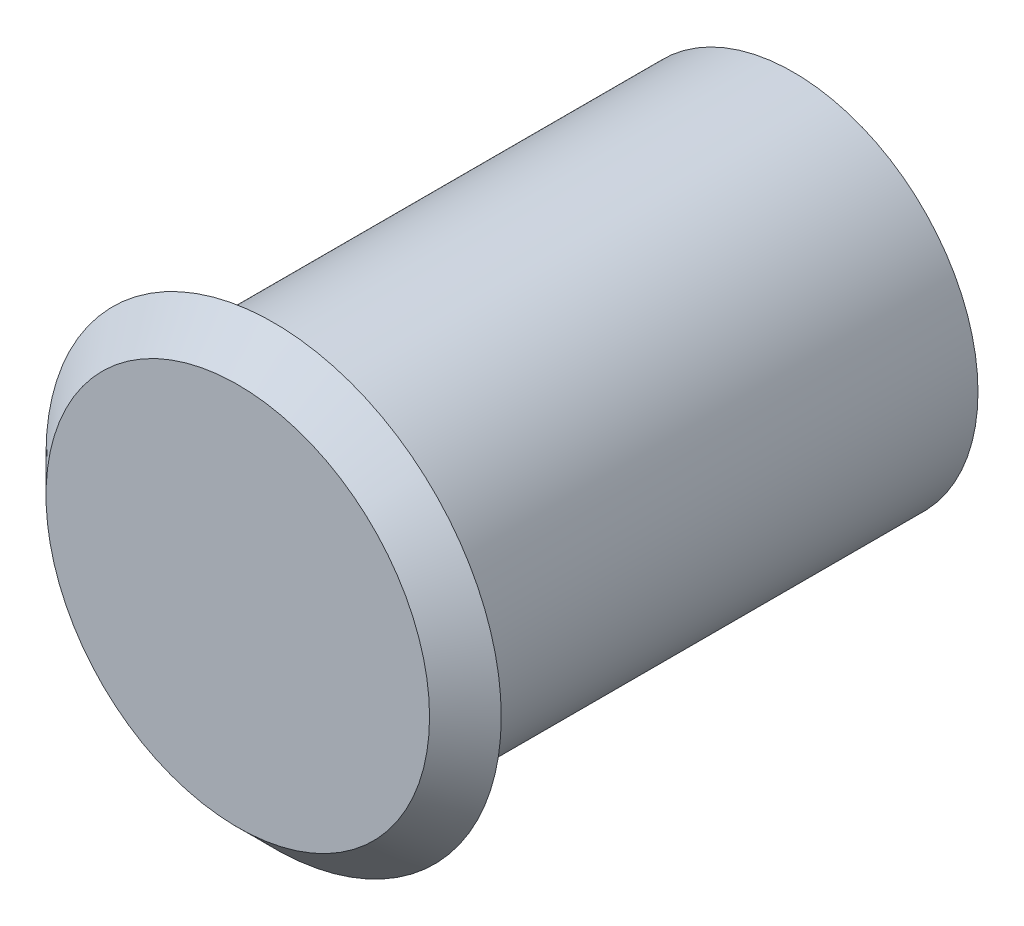
ISO-10303-21;
HEADER;
FILE_DESCRIPTION(('STEP AP214'),'2;1');
FILE_NAME('part.step','',(''),(''),'','','');
FILE_SCHEMA(('AUTOMOTIVE_DESIGN { 1 0 10303 214 1 1 1 1 }'));
ENDSEC;
DATA;
#1=APPLICATION_CONTEXT('core data for automotive mechanical design processes');
#2=APPLICATION_PROTOCOL_DEFINITION('international standard','automotive_design',2000,#1);
#3=PRODUCT_CONTEXT('',#1,'mechanical');
#4=PRODUCT('Part','Part','',(#3));
#5=PRODUCT_RELATED_PRODUCT_CATEGORY('part','',(#4));
#6=PRODUCT_DEFINITION_FORMATION('','',#4);
#7=PRODUCT_DEFINITION_CONTEXT('part definition',#1,'design');
#8=PRODUCT_DEFINITION('design','',#6,#7);
#9=PRODUCT_DEFINITION_SHAPE('','',#8);
#10=(LENGTH_UNIT() NAMED_UNIT(*) SI_UNIT(.MILLI.,.METRE.));
#11=(NAMED_UNIT(*) PLANE_ANGLE_UNIT() SI_UNIT($,.RADIAN.));
#12=(NAMED_UNIT(*) SI_UNIT($,.STERADIAN.) SOLID_ANGLE_UNIT());
#13=UNCERTAINTY_MEASURE_WITH_UNIT(LENGTH_MEASURE(1.E-05),#10,'distance_accuracy_value','');
#14=(GEOMETRIC_REPRESENTATION_CONTEXT(3) GLOBAL_UNCERTAINTY_ASSIGNED_CONTEXT((#13)) GLOBAL_UNIT_ASSIGNED_CONTEXT((#10,
#11,#12)) REPRESENTATION_CONTEXT('',''));
#15=CARTESIAN_POINT('',(0.,0.,0.));
#16=DIRECTION('',(0.,0.,1.));
#17=DIRECTION('',(1.,0.,0.));
#18=AXIS2_PLACEMENT_3D('',#15,#16,#17);
#19=CARTESIAN_POINT('',(0.,0.,29.));
#20=DIRECTION('',(0.,0.,-1.));
#21=DIRECTION('',(-1.,0.,0.));
#22=AXIS2_PLACEMENT_3D('',#19,#20,#21);
#23=CYLINDRICAL_SURFACE('',#22,10.3);
#24=CARTESIAN_POINT('',(0.,0.,29.));
#25=DIRECTION('',(0.,0.,1.));
#26=DIRECTION('',(1.,0.,0.));
#27=AXIS2_PLACEMENT_3D('',#24,#25,#26);
#28=CIRCLE('',#27,10.3);
#29=CARTESIAN_POINT('',(-10.3,0.,29.));
#30=VERTEX_POINT('',#29);
#31=EDGE_CURVE('E47',#30,#30,#28,.T.);
#32=CARTESIAN_POINT('',(0.,0.,0.));
#33=DIRECTION('',(0.,0.,1.));
#34=DIRECTION('',(1.,0.,0.));
#35=AXIS2_PLACEMENT_3D('',#32,#33,#34);
#36=CIRCLE('',#35,10.3);
#37=CARTESIAN_POINT('',(-10.3,0.,0.));
#38=VERTEX_POINT('',#37);
#39=EDGE_CURVE('E51',#38,#38,#36,.T.);
#40=CARTESIAN_POINT('',(-10.3,0.,29.));
#41=CARTESIAN_POINT('',(-10.3,0.,28.6979166666667));
#42=CARTESIAN_POINT('',(-10.3,0.,28.3958333333333));
#43=CARTESIAN_POINT('',(-10.3,0.,27.7916666666667));
#44=CARTESIAN_POINT('',(-10.3,0.,27.4895833333333));
#45=CARTESIAN_POINT('',(-10.3,0.,26.8854166666667));
#46=CARTESIAN_POINT('',(-10.3,0.,26.5833333333333));
#47=CARTESIAN_POINT('',(-10.3,0.,25.9791666666667));
#48=CARTESIAN_POINT('',(-10.3,0.,25.6770833333333));
#49=CARTESIAN_POINT('',(-10.3,0.,25.0729166666667));
#50=CARTESIAN_POINT('',(-10.3,0.,24.7708333333333));
#51=CARTESIAN_POINT('',(-10.3,0.,24.1666666666667));
#52=CARTESIAN_POINT('',(-10.3,0.,23.8645833333333));
#53=CARTESIAN_POINT('',(-10.3,0.,23.2604166666667));
#54=CARTESIAN_POINT('',(-10.3,0.,22.9583333333333));
#55=CARTESIAN_POINT('',(-10.3,0.,22.3541666666667));
#56=CARTESIAN_POINT('',(-10.3,0.,22.0520833333333));
#57=CARTESIAN_POINT('',(-10.3,0.,21.4479166666667));
#58=CARTESIAN_POINT('',(-10.3,0.,21.1458333333333));
#59=CARTESIAN_POINT('',(-10.3,0.,20.5416666666667));
#60=CARTESIAN_POINT('',(-10.3,0.,20.2395833333333));
#61=CARTESIAN_POINT('',(-10.3,0.,19.6354166666667));
#62=CARTESIAN_POINT('',(-10.3,0.,19.3333333333333));
#63=CARTESIAN_POINT('',(-10.3,0.,18.7291666666667));
#64=CARTESIAN_POINT('',(-10.3,0.,18.4270833333333));
#65=CARTESIAN_POINT('',(-10.3,0.,17.8229166666667));
#66=CARTESIAN_POINT('',(-10.3,0.,17.5208333333333));
#67=CARTESIAN_POINT('',(-10.3,0.,16.9166666666667));
#68=CARTESIAN_POINT('',(-10.3,0.,16.6145833333333));
#69=CARTESIAN_POINT('',(-10.3,0.,16.0104166666667));
#70=CARTESIAN_POINT('',(-10.3,0.,15.7083333333333));
#71=CARTESIAN_POINT('',(-10.3,0.,15.1041666666667));
#72=CARTESIAN_POINT('',(-10.3,0.,14.8020833333333));
#73=CARTESIAN_POINT('',(-10.3,0.,14.1979166666667));
#74=CARTESIAN_POINT('',(-10.3,0.,13.8958333333333));
#75=CARTESIAN_POINT('',(-10.3,0.,13.2916666666667));
#76=CARTESIAN_POINT('',(-10.3,0.,12.9895833333333));
#77=CARTESIAN_POINT('',(-10.3,0.,12.3854166666667));
#78=CARTESIAN_POINT('',(-10.3,0.,12.0833333333333));
#79=CARTESIAN_POINT('',(-10.3,0.,11.4791666666667));
#80=CARTESIAN_POINT('',(-10.3,0.,11.1770833333333));
#81=CARTESIAN_POINT('',(-10.3,0.,10.5729166666667));
#82=CARTESIAN_POINT('',(-10.3,0.,10.2708333333333));
#83=CARTESIAN_POINT('',(-10.3,0.,9.66666666666667));
#84=CARTESIAN_POINT('',(-10.3,0.,9.36458333333333));
#85=CARTESIAN_POINT('',(-10.3,0.,8.76041666666667));
#86=CARTESIAN_POINT('',(-10.3,0.,8.45833333333333));
#87=CARTESIAN_POINT('',(-10.3,0.,7.85416666666667));
#88=CARTESIAN_POINT('',(-10.3,0.,7.55208333333333));
#89=CARTESIAN_POINT('',(-10.3,0.,6.94791666666667));
#90=CARTESIAN_POINT('',(-10.3,0.,6.64583333333333));
#91=CARTESIAN_POINT('',(-10.3,0.,6.04166666666667));
#92=CARTESIAN_POINT('',(-10.3,0.,5.73958333333333));
#93=CARTESIAN_POINT('',(-10.3,0.,5.13541666666667));
#94=CARTESIAN_POINT('',(-10.3,0.,4.83333333333333));
#95=CARTESIAN_POINT('',(-10.3,0.,4.22916666666667));
#96=CARTESIAN_POINT('',(-10.3,0.,3.92708333333333));
#97=CARTESIAN_POINT('',(-10.3,0.,3.32291666666667));
#98=CARTESIAN_POINT('',(-10.3,0.,3.02083333333333));
#99=CARTESIAN_POINT('',(-10.3,0.,2.41666666666667));
#100=CARTESIAN_POINT('',(-10.3,0.,2.11458333333333));
#101=CARTESIAN_POINT('',(-10.3,0.,1.51041666666667));
#102=CARTESIAN_POINT('',(-10.3,0.,1.20833333333333));
#103=CARTESIAN_POINT('',(-10.3,0.,0.604166666666667));
#104=CARTESIAN_POINT('',(-10.3,0.,0.302083333333333));
#105=CARTESIAN_POINT('',(-10.3,0.,0.));
#106=B_SPLINE_CURVE_WITH_KNOTS('',3,(#40,#41,#42,#43,#44,#45,#46,#47,#48,#49,#50,#51,#52,#53,
#54,#55,#56,#57,#58,#59,#60,#61,#62,#63,#64,#65,#66,#67,#68,#69,#70,#71,#72,#73,#74,#75,#76,#77,
#78,#79,#80,#81,#82,#83,#84,#85,#86,#87,#88,#89,#90,#91,#92,#93,#94,#95,#96,#97,#98,#99,#100,
#101,#102,#103,#104,#105),.UNSPECIFIED.,.F.,.F.,(4,2,2,2,2,2,2,2,2,2,2,2,2,2,2,2,2,2,2,2,2,2,2,
2,2,2,2,2,2,2,2,2,4),(0.,0.906250000000001,1.8125,2.71875,3.625,4.53125,5.4375,6.34375,7.25,
8.15625,9.0625,9.96875,10.875,11.78125,12.6875,13.59375,14.5,15.40625,16.3125,17.21875,18.125,
19.03125,19.9375,20.84375,21.75,22.65625,23.5625,24.46875,25.375,26.28125,27.1875,28.09375,29.),.UNSPECIFIED.);
#107=EDGE_CURVE('BSEAM39',#30,#38,#106,.T.);
#108=ORIENTED_EDGE('',*,*,#31,.F.);
#109=ORIENTED_EDGE('',*,*,#39,.T.);
#110=ORIENTED_EDGE('',*,*,#107,.T.);
#111=ORIENTED_EDGE('',*,*,#107,.F.);
#112=EDGE_LOOP('',(#108,#110,#109,#111));
#113=FACE_BOUND('',#112,.T.);
#114=ADVANCED_FACE('F39',(#113),#23,.T.);
#115=CARTESIAN_POINT('',(0.,0.,0.));
#116=DIRECTION('',(0.,0.,1.));
#117=DIRECTION('',(1.,0.,0.));
#118=AXIS2_PLACEMENT_3D('',#115,#116,#117);
#119=PLANE('',#118);
#120=ORIENTED_EDGE('',*,*,#39,.F.);
#121=EDGE_LOOP('',(#120));
#122=FACE_BOUND('',#121,.T.);
#123=ADVANCED_FACE('F72',(#122),#119,.F.);
#124=CARTESIAN_POINT('',(0.,0.,31.));
#125=DIRECTION('',(0.,0.,1.));
#126=DIRECTION('',(1.,0.,0.));
#127=AXIS2_PLACEMENT_3D('',#124,#125,#126);
#128=PLANE('',#127);
#129=CARTESIAN_POINT('',(0.,0.,31.));
#130=DIRECTION('',(0.,0.,1.));
#131=DIRECTION('',(1.,0.,0.));
#132=AXIS2_PLACEMENT_3D('',#129,#130,#131);
#133=CIRCLE('',#132,10.7);
#134=CARTESIAN_POINT('',(10.7,0.,31.));
#135=VERTEX_POINT('',#134);
#136=EDGE_CURVE('E10',#135,#135,#133,.T.);
#137=ORIENTED_EDGE('',*,*,#136,.T.);
#138=EDGE_LOOP('',(#137));
#139=FACE_BOUND('',#138,.T.);
#140=ADVANCED_FACE('F65',(#139),#128,.T.);
#141=CARTESIAN_POINT('',(0.,0.,29.));
#142=DIRECTION('',(0.,0.,1.));
#143=DIRECTION('',(1.,0.,0.));
#144=AXIS2_PLACEMENT_3D('',#141,#142,#143);
#145=PLANE('',#144);
#146=ORIENTED_EDGE('',*,*,#31,.T.);
#147=EDGE_LOOP('',(#146));
#148=FACE_BOUND('',#147,.T.);
#149=CARTESIAN_POINT('',(0.,0.,29.));
#150=DIRECTION('',(0.,0.,1.));
#151=DIRECTION('',(1.,0.,0.));
#152=AXIS2_PLACEMENT_3D('',#149,#150,#151);
#153=CIRCLE('',#152,12.7);
#154=CARTESIAN_POINT('',(12.7,0.,29.));
#155=VERTEX_POINT('',#154);
#156=EDGE_CURVE('E56',#155,#155,#153,.T.);
#157=ORIENTED_EDGE('',*,*,#156,.F.);
#158=EDGE_LOOP('',(#157));
#159=FACE_BOUND('',#158,.T.);
#160=ADVANCED_FACE('F63',(#148,#159),#145,.F.);
#161=CARTESIAN_POINT('',(0.,0.,31.));
#162=DIRECTION('',(0.,0.,-1.));
#163=DIRECTION('',(-1.,0.,0.));
#164=AXIS2_PLACEMENT_3D('',#161,#162,#163);
#165=CONICAL_SURFACE('',#164,10.7,0.785398163397446);
#166=ORIENTED_EDGE('',*,*,#156,.T.);
#167=EDGE_LOOP('',(#166));
#168=FACE_BOUND('',#167,.T.);
#169=ORIENTED_EDGE('',*,*,#136,.F.);
#170=EDGE_LOOP('',(#169));
#171=FACE_BOUND('',#170,.T.);
#172=ADVANCED_FACE('F42',(#168,#171),#165,.T.);
#173=CLOSED_SHELL('',(#114,#123,#140,#160,#172));
#174=MANIFOLD_SOLID_BREP('B2',#173);
#175=ADVANCED_BREP_SHAPE_REPRESENTATION('',(#18,#174),#14);
#176=SHAPE_DEFINITION_REPRESENTATION(#9,#175);
ENDSEC;
END-ISO-10303-21;
